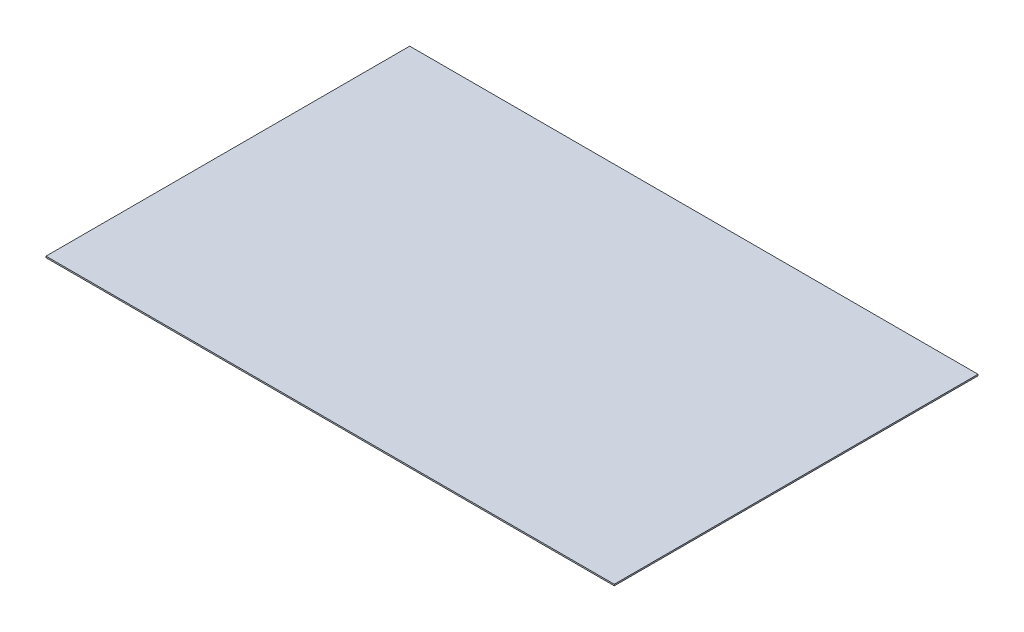
ISO-10303-21;
HEADER;
FILE_DESCRIPTION(('STEP AP214'),'2;1');
FILE_NAME('part.step','',(''),(''),'','','');
FILE_SCHEMA(('AUTOMOTIVE_DESIGN { 1 0 10303 214 1 1 1 1 }'));
ENDSEC;
DATA;
#1=APPLICATION_CONTEXT('core data for automotive mechanical design processes');
#2=APPLICATION_PROTOCOL_DEFINITION('international standard','automotive_design',2000,#1);
#3=PRODUCT_CONTEXT('',#1,'mechanical');
#4=PRODUCT('Part','Part','',(#3));
#5=PRODUCT_RELATED_PRODUCT_CATEGORY('part','',(#4));
#6=PRODUCT_DEFINITION_FORMATION('','',#4);
#7=PRODUCT_DEFINITION_CONTEXT('part definition',#1,'design');
#8=PRODUCT_DEFINITION('design','',#6,#7);
#9=PRODUCT_DEFINITION_SHAPE('','',#8);
#10=(LENGTH_UNIT() NAMED_UNIT(*) SI_UNIT(.MILLI.,.METRE.));
#11=(NAMED_UNIT(*) PLANE_ANGLE_UNIT() SI_UNIT($,.RADIAN.));
#12=(NAMED_UNIT(*) SI_UNIT($,.STERADIAN.) SOLID_ANGLE_UNIT());
#13=UNCERTAINTY_MEASURE_WITH_UNIT(LENGTH_MEASURE(1.E-05),#10,'distance_accuracy_value','');
#14=(GEOMETRIC_REPRESENTATION_CONTEXT(3) GLOBAL_UNCERTAINTY_ASSIGNED_CONTEXT((#13)) GLOBAL_UNIT_ASSIGNED_CONTEXT((#10,
#11,#12)) REPRESENTATION_CONTEXT('',''));
#15=CARTESIAN_POINT('',(0.,0.,0.));
#16=DIRECTION('',(0.,0.,1.));
#17=DIRECTION('',(1.,0.,0.));
#18=AXIS2_PLACEMENT_3D('',#15,#16,#17);
#19=CARTESIAN_POINT('',(200.,1.,128.));
#20=DIRECTION('',(-1.,0.,0.));
#21=DIRECTION('',(0.,0.,1.));
#22=AXIS2_PLACEMENT_3D('',#19,#20,#21);
#23=PLANE('',#22);
#24=DIRECTION('',(0.,0.,-1.));
#25=VECTOR('',#24,1.);
#26=CARTESIAN_POINT('',(200.,0.,128.));
#27=LINE('',#26,#25);
#28=CARTESIAN_POINT('',(200.,0.,128.));
#29=VERTEX_POINT('',#28);
#30=CARTESIAN_POINT('',(200.,0.,-128.));
#31=VERTEX_POINT('',#30);
#32=EDGE_CURVE('E115',#29,#31,#27,.T.);
#33=ORIENTED_EDGE('',*,*,#32,.T.);
#34=DIRECTION('',(0.,-1.,0.));
#35=VECTOR('',#34,1.);
#36=CARTESIAN_POINT('',(200.,1.,-128.));
#37=LINE('',#36,#35);
#38=CARTESIAN_POINT('',(200.,1.,-128.));
#39=VERTEX_POINT('',#38);
#40=EDGE_CURVE('E11',#39,#31,#37,.T.);
#41=ORIENTED_EDGE('',*,*,#40,.F.);
#42=DIRECTION('',(0.,0.,-1.));
#43=VECTOR('',#42,1.);
#44=CARTESIAN_POINT('',(200.,1.,128.));
#45=LINE('',#44,#43);
#46=CARTESIAN_POINT('',(200.,1.,128.));
#47=VERTEX_POINT('',#46);
#48=EDGE_CURVE('E102',#47,#39,#45,.T.);
#49=ORIENTED_EDGE('',*,*,#48,.F.);
#50=DIRECTION('',(0.,-1.,0.));
#51=VECTOR('',#50,1.);
#52=CARTESIAN_POINT('',(200.,1.,128.));
#53=LINE('',#52,#51);
#54=EDGE_CURVE('E111',#47,#29,#53,.T.);
#55=ORIENTED_EDGE('',*,*,#54,.T.);
#56=EDGE_LOOP('',(#33,#41,#49,#55));
#57=FACE_BOUND('',#56,.T.);
#58=ADVANCED_FACE('F51',(#57),#23,.F.);
#59=CARTESIAN_POINT('',(-200.,1.,-128.));
#60=DIRECTION('',(0.,0.,1.));
#61=DIRECTION('',(1.,0.,0.));
#62=AXIS2_PLACEMENT_3D('',#59,#60,#61);
#63=PLANE('',#62);
#64=DIRECTION('',(-1.,0.,0.));
#65=VECTOR('',#64,1.);
#66=CARTESIAN_POINT('',(-200.,0.,-128.));
#67=LINE('',#66,#65);
#68=CARTESIAN_POINT('',(-200.,0.,-128.));
#69=VERTEX_POINT('',#68);
#70=EDGE_CURVE('E106',#31,#69,#67,.T.);
#71=ORIENTED_EDGE('',*,*,#70,.T.);
#72=DIRECTION('',(0.,-1.,0.));
#73=VECTOR('',#72,1.);
#74=CARTESIAN_POINT('',(-200.,1.,-128.));
#75=LINE('',#74,#73);
#76=CARTESIAN_POINT('',(-200.,1.,-128.));
#77=VERTEX_POINT('',#76);
#78=EDGE_CURVE('E59',#77,#69,#75,.T.);
#79=ORIENTED_EDGE('',*,*,#78,.F.);
#80=DIRECTION('',(-1.,0.,0.));
#81=VECTOR('',#80,1.);
#82=CARTESIAN_POINT('',(-200.,1.,-128.));
#83=LINE('',#82,#81);
#84=EDGE_CURVE('E97',#39,#77,#83,.T.);
#85=ORIENTED_EDGE('',*,*,#84,.F.);
#86=ORIENTED_EDGE('',*,*,#40,.T.);
#87=EDGE_LOOP('',(#71,#79,#85,#86));
#88=FACE_BOUND('',#87,.T.);
#89=ADVANCED_FACE('F105',(#88),#63,.F.);
#90=CARTESIAN_POINT('',(-200.,1.,128.));
#91=DIRECTION('',(1.,0.,0.));
#92=DIRECTION('',(0.,0.,-1.));
#93=AXIS2_PLACEMENT_3D('',#90,#91,#92);
#94=PLANE('',#93);
#95=DIRECTION('',(0.,0.,1.));
#96=VECTOR('',#95,1.);
#97=CARTESIAN_POINT('',(-200.,0.,128.));
#98=LINE('',#97,#96);
#99=CARTESIAN_POINT('',(-200.,0.,128.));
#100=VERTEX_POINT('',#99);
#101=EDGE_CURVE('E84',#69,#100,#98,.T.);
#102=ORIENTED_EDGE('',*,*,#101,.T.);
#103=DIRECTION('',(0.,-1.,0.));
#104=VECTOR('',#103,1.);
#105=CARTESIAN_POINT('',(-200.,1.,128.));
#106=LINE('',#105,#104);
#107=CARTESIAN_POINT('',(-200.,1.,128.));
#108=VERTEX_POINT('',#107);
#109=EDGE_CURVE('E107',#108,#100,#106,.T.);
#110=ORIENTED_EDGE('',*,*,#109,.F.);
#111=DIRECTION('',(0.,0.,1.));
#112=VECTOR('',#111,1.);
#113=CARTESIAN_POINT('',(-200.,1.,128.));
#114=LINE('',#113,#112);
#115=EDGE_CURVE('E100',#77,#108,#114,.T.);
#116=ORIENTED_EDGE('',*,*,#115,.F.);
#117=ORIENTED_EDGE('',*,*,#78,.T.);
#118=EDGE_LOOP('',(#102,#110,#116,#117));
#119=FACE_BOUND('',#118,.T.);
#120=ADVANCED_FACE('F108',(#119),#94,.F.);
#121=CARTESIAN_POINT('',(-200.,1.,128.));
#122=DIRECTION('',(0.,0.,-1.));
#123=DIRECTION('',(-1.,0.,0.));
#124=AXIS2_PLACEMENT_3D('',#121,#122,#123);
#125=PLANE('',#124);
#126=DIRECTION('',(1.,0.,0.));
#127=VECTOR('',#126,1.);
#128=CARTESIAN_POINT('',(-200.,0.,128.));
#129=LINE('',#128,#127);
#130=EDGE_CURVE('E90',#100,#29,#129,.T.);
#131=ORIENTED_EDGE('',*,*,#130,.T.);
#132=ORIENTED_EDGE('',*,*,#54,.F.);
#133=DIRECTION('',(1.,0.,0.));
#134=VECTOR('',#133,1.);
#135=CARTESIAN_POINT('',(-200.,1.,128.));
#136=LINE('',#135,#134);
#137=EDGE_CURVE('E67',#108,#47,#136,.T.);
#138=ORIENTED_EDGE('',*,*,#137,.F.);
#139=ORIENTED_EDGE('',*,*,#109,.T.);
#140=EDGE_LOOP('',(#131,#132,#138,#139));
#141=FACE_BOUND('',#140,.T.);
#142=ADVANCED_FACE('F124',(#141),#125,.F.);
#143=CARTESIAN_POINT('',(0.,1.,0.));
#144=DIRECTION('',(0.,-1.,0.));
#145=DIRECTION('',(0.,0.,-1.));
#146=AXIS2_PLACEMENT_3D('',#143,#144,#145);
#147=PLANE('',#146);
#148=ORIENTED_EDGE('',*,*,#48,.T.);
#149=ORIENTED_EDGE('',*,*,#84,.T.);
#150=ORIENTED_EDGE('',*,*,#115,.T.);
#151=ORIENTED_EDGE('',*,*,#137,.T.);
#152=EDGE_LOOP('',(#148,#149,#150,#151));
#153=FACE_BOUND('',#152,.T.);
#154=ADVANCED_FACE('F98',(#153),#147,.F.);
#155=CARTESIAN_POINT('',(0.,0.,0.));
#156=DIRECTION('',(0.,-1.,0.));
#157=DIRECTION('',(0.,0.,-1.));
#158=AXIS2_PLACEMENT_3D('',#155,#156,#157);
#159=PLANE('',#158);
#160=ORIENTED_EDGE('',*,*,#32,.F.);
#161=ORIENTED_EDGE('',*,*,#130,.F.);
#162=ORIENTED_EDGE('',*,*,#101,.F.);
#163=ORIENTED_EDGE('',*,*,#70,.F.);
#164=EDGE_LOOP('',(#160,#161,#162,#163));
#165=FACE_BOUND('',#164,.T.);
#166=ADVANCED_FACE('F127',(#165),#159,.T.);
#167=CLOSED_SHELL('',(#58,#89,#120,#142,#154,#166));
#168=MANIFOLD_SOLID_BREP('B2',#167);
#169=ADVANCED_BREP_SHAPE_REPRESENTATION('',(#18,#168),#14);
#170=SHAPE_DEFINITION_REPRESENTATION(#9,#169);
ENDSEC;
END-ISO-10303-21;
